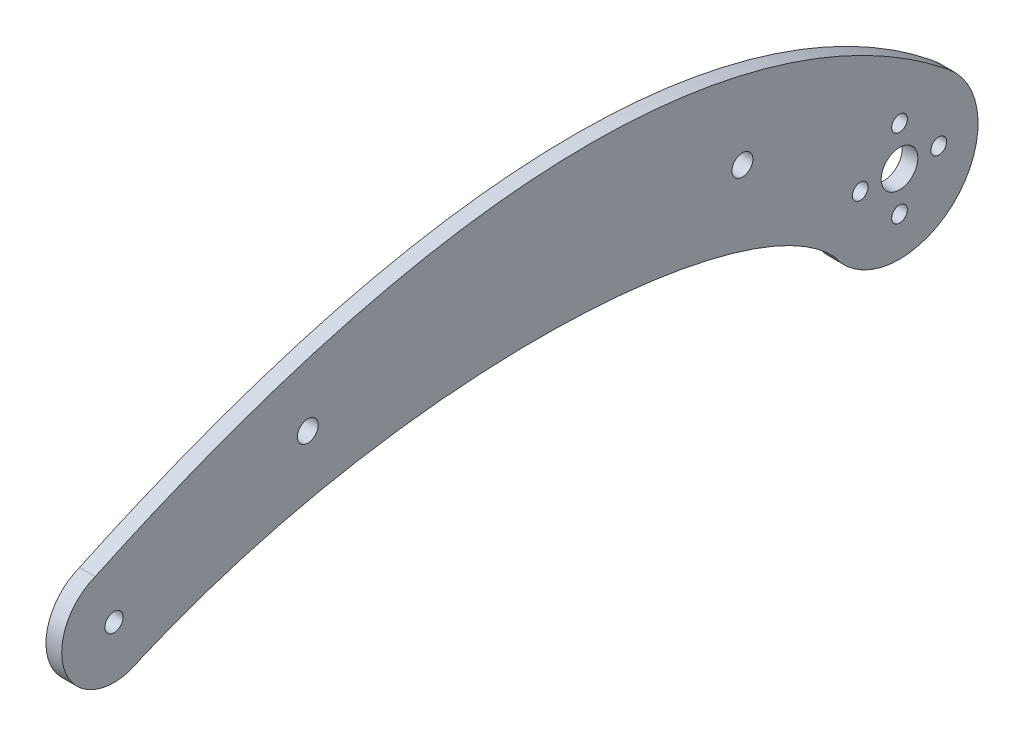
ISO-10303-21;
HEADER;
FILE_DESCRIPTION(('STEP AP214'),'2;1');
FILE_NAME('part.step','',(''),(''),'','','');
FILE_SCHEMA(('AUTOMOTIVE_DESIGN { 1 0 10303 214 1 1 1 1 }'));
ENDSEC;
DATA;
#1=APPLICATION_CONTEXT('core data for automotive mechanical design processes');
#2=APPLICATION_PROTOCOL_DEFINITION('international standard','automotive_design',2000,#1);
#3=PRODUCT_CONTEXT('',#1,'mechanical');
#4=PRODUCT('Part','Part','',(#3));
#5=PRODUCT_RELATED_PRODUCT_CATEGORY('part','',(#4));
#6=PRODUCT_DEFINITION_FORMATION('','',#4);
#7=PRODUCT_DEFINITION_CONTEXT('part definition',#1,'design');
#8=PRODUCT_DEFINITION('design','',#6,#7);
#9=PRODUCT_DEFINITION_SHAPE('','',#8);
#10=(LENGTH_UNIT() NAMED_UNIT(*) SI_UNIT(.MILLI.,.METRE.));
#11=(NAMED_UNIT(*) PLANE_ANGLE_UNIT() SI_UNIT($,.RADIAN.));
#12=(NAMED_UNIT(*) SI_UNIT($,.STERADIAN.) SOLID_ANGLE_UNIT());
#13=UNCERTAINTY_MEASURE_WITH_UNIT(LENGTH_MEASURE(1.E-05),#10,'distance_accuracy_value','');
#14=(GEOMETRIC_REPRESENTATION_CONTEXT(3) GLOBAL_UNCERTAINTY_ASSIGNED_CONTEXT((#13)) GLOBAL_UNIT_ASSIGNED_CONTEXT((#10,
#11,#12)) REPRESENTATION_CONTEXT('',''));
#15=CARTESIAN_POINT('',(0.,0.,0.));
#16=DIRECTION('',(0.,0.,1.));
#17=DIRECTION('',(1.,0.,0.));
#18=AXIS2_PLACEMENT_3D('',#15,#16,#17);
#19=CARTESIAN_POINT('',(3.,6.39651471446297,65.9547983464172));
#20=DIRECTION('',(1.,0.,0.));
#21=DIRECTION('',(0.,0.,-1.));
#22=AXIS2_PLACEMENT_3D('',#19,#20,#21);
#23=PLANE('',#22);
#24=CARTESIAN_POINT('',(3.,7.5,0.));
#25=DIRECTION('',(1.,0.,0.));
#26=DIRECTION('',(0.,0.,-1.));
#27=AXIS2_PLACEMENT_3D('',#24,#25,#26);
#28=CIRCLE('',#27,1.5);
#29=CARTESIAN_POINT('',(3.,7.5,-1.5));
#30=VERTEX_POINT('',#29);
#31=EDGE_CURVE('E168',#30,#30,#28,.T.);
#32=ORIENTED_EDGE('',*,*,#31,.F.);
#33=EDGE_LOOP('',(#32));
#34=FACE_BOUND('',#33,.T.);
#35=CARTESIAN_POINT('',(3.,0.,7.5));
#36=DIRECTION('',(1.,0.,0.));
#37=DIRECTION('',(0.,0.,-1.));
#38=AXIS2_PLACEMENT_3D('',#35,#36,#37);
#39=CIRCLE('',#38,1.5);
#40=CARTESIAN_POINT('',(3.,0.,6.));
#41=VERTEX_POINT('',#40);
#42=EDGE_CURVE('E180',#41,#41,#39,.T.);
#43=ORIENTED_EDGE('',*,*,#42,.F.);
#44=EDGE_LOOP('',(#43));
#45=FACE_BOUND('',#44,.T.);
#46=CARTESIAN_POINT('',(3.,13.1171799999505,113.));
#47=DIRECTION('',(1.,0.,0.));
#48=DIRECTION('',(0.,0.,-1.));
#49=AXIS2_PLACEMENT_3D('',#46,#47,#48);
#50=CIRCLE('',#49,2.);
#51=CARTESIAN_POINT('',(3.,13.1171799999505,111.));
#52=VERTEX_POINT('',#51);
#53=EDGE_CURVE('E192',#52,#52,#50,.T.);
#54=ORIENTED_EDGE('',*,*,#53,.F.);
#55=EDGE_LOOP('',(#54));
#56=FACE_BOUND('',#55,.T.);
#57=CARTESIAN_POINT('',(3.,0.,0.));
#58=DIRECTION('',(1.,0.,0.));
#59=DIRECTION('',(0.,0.,-1.));
#60=AXIS2_PLACEMENT_3D('',#57,#58,#59);
#61=CIRCLE('',#60,3.5);
#62=CARTESIAN_POINT('',(3.,0.,-3.5));
#63=VERTEX_POINT('',#62);
#64=EDGE_CURVE('E204',#63,#63,#61,.T.);
#65=ORIENTED_EDGE('',*,*,#64,.F.);
#66=EDGE_LOOP('',(#65));
#67=FACE_BOUND('',#66,.T.);
#68=CARTESIAN_POINT('',(3.,-8.59851876654942,144.89456416931));
#69=CARTESIAN_POINT('',(3.,13.0893357463916,94.3995636790345));
#70=CARTESIAN_POINT('',(3.,9.60820748675708,29.0217902647538));
#71=CARTESIAN_POINT('',(3.,-8.32199321719293,12.4797607706636));
#72=B_SPLINE_CURVE_WITH_KNOTS('',3,(#68,#69,#70,#71),.UNSPECIFIED.,.F.,.F.,(4,4),(0.,1.),.UNSPECIFIED.);
#73=CARTESIAN_POINT('',(3.,-8.59851876654942,144.89456416931));
#74=VERTEX_POINT('',#73);
#75=CARTESIAN_POINT('',(3.,-8.32199321719289,12.4797607706637));
#76=VERTEX_POINT('',#75);
#77=EDGE_CURVE('E85',#74,#76,#72,.T.);
#78=ORIENTED_EDGE('',*,*,#77,.T.);
#79=CARTESIAN_POINT('',(3.,0.,0.));
#80=DIRECTION('',(1.,0.,0.));
#81=DIRECTION('',(0.,0.,-1.));
#82=AXIS2_PLACEMENT_3D('',#79,#80,#81);
#83=CIRCLE('',#82,15.);
#84=CARTESIAN_POINT('',(3.,11.7832674671061,-9.28195064620789));
#85=VERTEX_POINT('',#84);
#86=EDGE_CURVE('E80',#76,#85,#83,.T.);
#87=ORIENTED_EDGE('',*,*,#86,.T.);
#88=CARTESIAN_POINT('',(3.,11.7832674671061,-9.28195064620791));
#89=CARTESIAN_POINT('',(3.,21.6661173857813,3.02868552316829));
#90=CARTESIAN_POINT('',(3.,57.0174540483026,52.0274645532871));
#91=CARTESIAN_POINT('',(3.,9.33360602277759,153.589400870838));
#92=B_SPLINE_CURVE_WITH_KNOTS('',3,(#88,#89,#90,#91),.UNSPECIFIED.,.F.,.F.,(4,4),(0.,1.),.UNSPECIFIED.);
#93=CARTESIAN_POINT('',(3.,9.33360602277759,153.589400870838));
#94=VERTEX_POINT('',#93);
#95=EDGE_CURVE('E83',#85,#94,#92,.T.);
#96=ORIENTED_EDGE('',*,*,#95,.T.);
#97=CARTESIAN_POINT('',(3.,0.,150.));
#98=DIRECTION('',(1.,0.,0.));
#99=DIRECTION('',(0.,0.,-1.));
#100=AXIS2_PLACEMENT_3D('',#97,#98,#99);
#101=CIRCLE('',#100,10.);
#102=EDGE_CURVE('E50',#94,#74,#101,.T.);
#103=ORIENTED_EDGE('',*,*,#102,.T.);
#104=EDGE_LOOP('',(#78,#87,#96,#103));
#105=FACE_BOUND('',#104,.T.);
#106=CARTESIAN_POINT('',(3.,0.,150.));
#107=DIRECTION('',(1.,0.,0.));
#108=DIRECTION('',(0.,0.,-1.));
#109=AXIS2_PLACEMENT_3D('',#106,#107,#108);
#110=CIRCLE('',#109,1.75000000000001);
#111=CARTESIAN_POINT('',(3.,0.,148.25));
#112=VERTEX_POINT('',#111);
#113=EDGE_CURVE('E198',#112,#112,#110,.T.);
#114=ORIENTED_EDGE('',*,*,#113,.F.);
#115=EDGE_LOOP('',(#114));
#116=FACE_BOUND('',#115,.T.);
#117=CARTESIAN_POINT('',(3.,15.6147810456113,30.));
#118=DIRECTION('',(1.,0.,0.));
#119=DIRECTION('',(0.,0.,-1.));
#120=AXIS2_PLACEMENT_3D('',#117,#118,#119);
#121=CIRCLE('',#120,2.);
#122=CARTESIAN_POINT('',(3.,15.6147810456113,28.));
#123=VERTEX_POINT('',#122);
#124=EDGE_CURVE('E186',#123,#123,#121,.T.);
#125=ORIENTED_EDGE('',*,*,#124,.F.);
#126=EDGE_LOOP('',(#125));
#127=FACE_BOUND('',#126,.T.);
#128=CARTESIAN_POINT('',(3.,-7.5,0.));
#129=DIRECTION('',(1.,0.,0.));
#130=DIRECTION('',(0.,0.,-1.));
#131=AXIS2_PLACEMENT_3D('',#128,#129,#130);
#132=CIRCLE('',#131,1.5);
#133=CARTESIAN_POINT('',(3.,-7.5,-1.5));
#134=VERTEX_POINT('',#133);
#135=EDGE_CURVE('E174',#134,#134,#132,.T.);
#136=ORIENTED_EDGE('',*,*,#135,.F.);
#137=EDGE_LOOP('',(#136));
#138=FACE_BOUND('',#137,.T.);
#139=CARTESIAN_POINT('',(3.,0.,-7.5));
#140=DIRECTION('',(1.,0.,0.));
#141=DIRECTION('',(0.,0.,-1.));
#142=AXIS2_PLACEMENT_3D('',#139,#140,#141);
#143=CIRCLE('',#142,1.5);
#144=CARTESIAN_POINT('',(3.,0.,-9.));
#145=VERTEX_POINT('',#144);
#146=EDGE_CURVE('E159',#145,#145,#143,.T.);
#147=ORIENTED_EDGE('',*,*,#146,.F.);
#148=EDGE_LOOP('',(#147));
#149=FACE_BOUND('',#148,.T.);
#150=ADVANCED_FACE('F32',(#34,#45,#56,#67,#105,#116,#127,#138,#149),#23,.T.);
#151=CARTESIAN_POINT('',(0.,6.39651471446297,65.9547983464172));
#152=DIRECTION('',(1.,0.,0.));
#153=DIRECTION('',(0.,0.,-1.));
#154=AXIS2_PLACEMENT_3D('',#151,#152,#153);
#155=PLANE('',#154);
#156=CARTESIAN_POINT('',(0.,7.5,0.));
#157=DIRECTION('',(1.,0.,0.));
#158=DIRECTION('',(0.,0.,-1.));
#159=AXIS2_PLACEMENT_3D('',#156,#157,#158);
#160=CIRCLE('',#159,1.5);
#161=CARTESIAN_POINT('',(0.,7.5,-1.5));
#162=VERTEX_POINT('',#161);
#163=EDGE_CURVE('E165',#162,#162,#160,.T.);
#164=ORIENTED_EDGE('',*,*,#163,.T.);
#165=EDGE_LOOP('',(#164));
#166=FACE_BOUND('',#165,.T.);
#167=CARTESIAN_POINT('',(0.,0.,7.5));
#168=DIRECTION('',(1.,0.,0.));
#169=DIRECTION('',(0.,0.,-1.));
#170=AXIS2_PLACEMENT_3D('',#167,#168,#169);
#171=CIRCLE('',#170,1.5);
#172=CARTESIAN_POINT('',(0.,0.,6.));
#173=VERTEX_POINT('',#172);
#174=EDGE_CURVE('E177',#173,#173,#171,.T.);
#175=ORIENTED_EDGE('',*,*,#174,.T.);
#176=EDGE_LOOP('',(#175));
#177=FACE_BOUND('',#176,.T.);
#178=CARTESIAN_POINT('',(0.,13.1171799999505,113.));
#179=DIRECTION('',(1.,0.,0.));
#180=DIRECTION('',(0.,0.,-1.));
#181=AXIS2_PLACEMENT_3D('',#178,#179,#180);
#182=CIRCLE('',#181,2.);
#183=CARTESIAN_POINT('',(0.,13.1171799999505,111.));
#184=VERTEX_POINT('',#183);
#185=EDGE_CURVE('E189',#184,#184,#182,.T.);
#186=ORIENTED_EDGE('',*,*,#185,.T.);
#187=EDGE_LOOP('',(#186));
#188=FACE_BOUND('',#187,.T.);
#189=CARTESIAN_POINT('',(0.,0.,0.));
#190=DIRECTION('',(1.,0.,0.));
#191=DIRECTION('',(0.,0.,-1.));
#192=AXIS2_PLACEMENT_3D('',#189,#190,#191);
#193=CIRCLE('',#192,3.5);
#194=CARTESIAN_POINT('',(0.,0.,-3.5));
#195=VERTEX_POINT('',#194);
#196=EDGE_CURVE('E201',#195,#195,#193,.T.);
#197=ORIENTED_EDGE('',*,*,#196,.T.);
#198=EDGE_LOOP('',(#197));
#199=FACE_BOUND('',#198,.T.);
#200=CARTESIAN_POINT('',(0.,-8.59851876654942,144.89456416931));
#201=CARTESIAN_POINT('',(0.,13.0893357463916,94.3995636790345));
#202=CARTESIAN_POINT('',(0.,9.60820748675708,29.0217902647538));
#203=CARTESIAN_POINT('',(0.,-8.32199321719293,12.4797607706636));
#204=B_SPLINE_CURVE_WITH_KNOTS('',3,(#200,#201,#202,#203),.UNSPECIFIED.,.F.,.F.,(4,4),(0.,1.),.UNSPECIFIED.);
#205=CARTESIAN_POINT('',(0.,-8.59851876654942,144.89456416931));
#206=VERTEX_POINT('',#205);
#207=CARTESIAN_POINT('',(0.,-8.32199321719289,12.4797607706637));
#208=VERTEX_POINT('',#207);
#209=EDGE_CURVE('E207',#206,#208,#204,.T.);
#210=ORIENTED_EDGE('',*,*,#209,.F.);
#211=CARTESIAN_POINT('',(0.,0.,150.));
#212=DIRECTION('',(1.,0.,0.));
#213=DIRECTION('',(0.,0.,-1.));
#214=AXIS2_PLACEMENT_3D('',#211,#212,#213);
#215=CIRCLE('',#214,10.);
#216=CARTESIAN_POINT('',(0.,9.33360602277759,153.589400870838));
#217=VERTEX_POINT('',#216);
#218=EDGE_CURVE('E73',#217,#206,#215,.T.);
#219=ORIENTED_EDGE('',*,*,#218,.F.);
#220=CARTESIAN_POINT('',(0.,11.7832674671061,-9.28195064620791));
#221=CARTESIAN_POINT('',(0.,21.6661173857813,3.02868552316829));
#222=CARTESIAN_POINT('',(0.,57.0174540483026,52.0274645532871));
#223=CARTESIAN_POINT('',(0.,9.33360602277759,153.589400870838));
#224=B_SPLINE_CURVE_WITH_KNOTS('',3,(#220,#221,#222,#223),.UNSPECIFIED.,.F.,.F.,(4,4),(0.,1.),.UNSPECIFIED.);
#225=CARTESIAN_POINT('',(0.,11.7832674671061,-9.28195064620789));
#226=VERTEX_POINT('',#225);
#227=EDGE_CURVE('E67',#226,#217,#224,.T.);
#228=ORIENTED_EDGE('',*,*,#227,.F.);
#229=CARTESIAN_POINT('',(0.,0.,0.));
#230=DIRECTION('',(1.,0.,0.));
#231=DIRECTION('',(0.,0.,-1.));
#232=AXIS2_PLACEMENT_3D('',#229,#230,#231);
#233=CIRCLE('',#232,15.);
#234=EDGE_CURVE('E89',#208,#226,#233,.T.);
#235=ORIENTED_EDGE('',*,*,#234,.F.);
#236=EDGE_LOOP('',(#210,#219,#228,#235));
#237=FACE_BOUND('',#236,.T.);
#238=CARTESIAN_POINT('',(0.,0.,150.));
#239=DIRECTION('',(1.,0.,0.));
#240=DIRECTION('',(0.,0.,-1.));
#241=AXIS2_PLACEMENT_3D('',#238,#239,#240);
#242=CIRCLE('',#241,1.75000000000001);
#243=CARTESIAN_POINT('',(0.,0.,148.25));
#244=VERTEX_POINT('',#243);
#245=EDGE_CURVE('E195',#244,#244,#242,.T.);
#246=ORIENTED_EDGE('',*,*,#245,.T.);
#247=EDGE_LOOP('',(#246));
#248=FACE_BOUND('',#247,.T.);
#249=CARTESIAN_POINT('',(0.,15.6147810456113,30.));
#250=DIRECTION('',(1.,0.,0.));
#251=DIRECTION('',(0.,0.,-1.));
#252=AXIS2_PLACEMENT_3D('',#249,#250,#251);
#253=CIRCLE('',#252,2.);
#254=CARTESIAN_POINT('',(0.,15.6147810456113,28.));
#255=VERTEX_POINT('',#254);
#256=EDGE_CURVE('E183',#255,#255,#253,.T.);
#257=ORIENTED_EDGE('',*,*,#256,.T.);
#258=EDGE_LOOP('',(#257));
#259=FACE_BOUND('',#258,.T.);
#260=CARTESIAN_POINT('',(0.,-7.5,0.));
#261=DIRECTION('',(1.,0.,0.));
#262=DIRECTION('',(0.,0.,-1.));
#263=AXIS2_PLACEMENT_3D('',#260,#261,#262);
#264=CIRCLE('',#263,1.5);
#265=CARTESIAN_POINT('',(0.,-7.5,-1.5));
#266=VERTEX_POINT('',#265);
#267=EDGE_CURVE('E171',#266,#266,#264,.T.);
#268=ORIENTED_EDGE('',*,*,#267,.T.);
#269=EDGE_LOOP('',(#268));
#270=FACE_BOUND('',#269,.T.);
#271=CARTESIAN_POINT('',(0.,0.,-7.5));
#272=DIRECTION('',(1.,0.,0.));
#273=DIRECTION('',(0.,0.,-1.));
#274=AXIS2_PLACEMENT_3D('',#271,#272,#273);
#275=CIRCLE('',#274,1.5);
#276=CARTESIAN_POINT('',(0.,0.,-9.));
#277=VERTEX_POINT('',#276);
#278=EDGE_CURVE('E162',#277,#277,#275,.T.);
#279=ORIENTED_EDGE('',*,*,#278,.T.);
#280=EDGE_LOOP('',(#279));
#281=FACE_BOUND('',#280,.T.);
#282=ADVANCED_FACE('F111',(#166,#177,#188,#199,#237,#248,#259,#270,#281),#155,.F.);
#283=DIRECTION('',(-1.,0.,0.));
#284=VECTOR('',#283,1.);
#285=SURFACE_OF_LINEAR_EXTRUSION('',#72,#284);
#286=ORIENTED_EDGE('',*,*,#209,.T.);
#287=DIRECTION('',(-1.,0.,0.));
#288=VECTOR('',#287,1.);
#289=CARTESIAN_POINT('',(3.,-8.32199321719289,12.4797607706637));
#290=LINE('',#289,#288);
#291=EDGE_CURVE('E11',#76,#208,#290,.T.);
#292=ORIENTED_EDGE('',*,*,#291,.F.);
#293=ORIENTED_EDGE('',*,*,#77,.F.);
#294=DIRECTION('',(-1.,0.,0.));
#295=VECTOR('',#294,1.);
#296=CARTESIAN_POINT('',(3.,-8.59851876654942,144.89456416931));
#297=LINE('',#296,#295);
#298=EDGE_CURVE('E93',#74,#206,#297,.T.);
#299=ORIENTED_EDGE('',*,*,#298,.T.);
#300=EDGE_LOOP('',(#286,#292,#293,#299));
#301=FACE_BOUND('',#300,.T.);
#302=ADVANCED_FACE('F34',(#301),#285,.F.);
#303=CARTESIAN_POINT('',(3.,0.,0.));
#304=DIRECTION('',(-1.,0.,0.));
#305=DIRECTION('',(0.,0.,1.));
#306=AXIS2_PLACEMENT_3D('',#303,#304,#305);
#307=CYLINDRICAL_SURFACE('',#306,15.);
#308=ORIENTED_EDGE('',*,*,#234,.T.);
#309=DIRECTION('',(-1.,0.,0.));
#310=VECTOR('',#309,1.);
#311=CARTESIAN_POINT('',(3.,11.7832674671061,-9.28195064620789));
#312=LINE('',#311,#310);
#313=EDGE_CURVE('E42',#85,#226,#312,.T.);
#314=ORIENTED_EDGE('',*,*,#313,.F.);
#315=ORIENTED_EDGE('',*,*,#86,.F.);
#316=ORIENTED_EDGE('',*,*,#291,.T.);
#317=EDGE_LOOP('',(#308,#314,#315,#316));
#318=FACE_BOUND('',#317,.T.);
#319=ADVANCED_FACE('F88',(#318),#307,.T.);
#320=DIRECTION('',(-1.,0.,0.));
#321=VECTOR('',#320,1.);
#322=SURFACE_OF_LINEAR_EXTRUSION('',#92,#321);
#323=ORIENTED_EDGE('',*,*,#227,.T.);
#324=DIRECTION('',(-1.,0.,0.));
#325=VECTOR('',#324,1.);
#326=CARTESIAN_POINT('',(3.,9.33360602277759,153.589400870838));
#327=LINE('',#326,#325);
#328=EDGE_CURVE('E90',#94,#217,#327,.T.);
#329=ORIENTED_EDGE('',*,*,#328,.F.);
#330=ORIENTED_EDGE('',*,*,#95,.F.);
#331=ORIENTED_EDGE('',*,*,#313,.T.);
#332=EDGE_LOOP('',(#323,#329,#330,#331));
#333=FACE_BOUND('',#332,.T.);
#334=ADVANCED_FACE('F91',(#333),#322,.F.);
#335=CARTESIAN_POINT('',(3.,0.,150.));
#336=DIRECTION('',(-1.,0.,0.));
#337=DIRECTION('',(0.,0.,1.));
#338=AXIS2_PLACEMENT_3D('',#335,#336,#337);
#339=CYLINDRICAL_SURFACE('',#338,10.);
#340=ORIENTED_EDGE('',*,*,#218,.T.);
#341=ORIENTED_EDGE('',*,*,#298,.F.);
#342=ORIENTED_EDGE('',*,*,#102,.F.);
#343=ORIENTED_EDGE('',*,*,#328,.T.);
#344=EDGE_LOOP('',(#340,#341,#342,#343));
#345=FACE_BOUND('',#344,.T.);
#346=ADVANCED_FACE('F105',(#345),#339,.T.);
#347=CARTESIAN_POINT('',(3.,0.,0.));
#348=DIRECTION('',(-1.,0.,0.));
#349=DIRECTION('',(0.,0.,1.));
#350=AXIS2_PLACEMENT_3D('',#347,#348,#349);
#351=CYLINDRICAL_SURFACE('',#350,3.5);
#352=ORIENTED_EDGE('',*,*,#64,.T.);
#353=EDGE_LOOP('',(#352));
#354=FACE_BOUND('',#353,.T.);
#355=ORIENTED_EDGE('',*,*,#196,.F.);
#356=EDGE_LOOP('',(#355));
#357=FACE_BOUND('',#356,.T.);
#358=ADVANCED_FACE('F123',(#354,#357),#351,.F.);
#359=CARTESIAN_POINT('',(3.,0.,150.));
#360=DIRECTION('',(-1.,0.,0.));
#361=DIRECTION('',(0.,0.,1.));
#362=AXIS2_PLACEMENT_3D('',#359,#360,#361);
#363=CYLINDRICAL_SURFACE('',#362,1.75000000000001);
#364=ORIENTED_EDGE('',*,*,#113,.T.);
#365=EDGE_LOOP('',(#364));
#366=FACE_BOUND('',#365,.T.);
#367=ORIENTED_EDGE('',*,*,#245,.F.);
#368=EDGE_LOOP('',(#367));
#369=FACE_BOUND('',#368,.T.);
#370=ADVANCED_FACE('F126',(#366,#369),#363,.F.);
#371=CARTESIAN_POINT('',(3.,13.1171799999505,113.));
#372=DIRECTION('',(-1.,0.,0.));
#373=DIRECTION('',(0.,0.,1.));
#374=AXIS2_PLACEMENT_3D('',#371,#372,#373);
#375=CYLINDRICAL_SURFACE('',#374,2.);
#376=ORIENTED_EDGE('',*,*,#53,.T.);
#377=EDGE_LOOP('',(#376));
#378=FACE_BOUND('',#377,.T.);
#379=ORIENTED_EDGE('',*,*,#185,.F.);
#380=EDGE_LOOP('',(#379));
#381=FACE_BOUND('',#380,.T.);
#382=ADVANCED_FACE('F130',(#378,#381),#375,.F.);
#383=CARTESIAN_POINT('',(3.,15.6147810456113,30.));
#384=DIRECTION('',(-1.,0.,0.));
#385=DIRECTION('',(0.,0.,1.));
#386=AXIS2_PLACEMENT_3D('',#383,#384,#385);
#387=CYLINDRICAL_SURFACE('',#386,2.);
#388=ORIENTED_EDGE('',*,*,#124,.T.);
#389=EDGE_LOOP('',(#388));
#390=FACE_BOUND('',#389,.T.);
#391=ORIENTED_EDGE('',*,*,#256,.F.);
#392=EDGE_LOOP('',(#391));
#393=FACE_BOUND('',#392,.T.);
#394=ADVANCED_FACE('F134',(#390,#393),#387,.F.);
#395=CARTESIAN_POINT('',(3.,0.,7.5));
#396=DIRECTION('',(-1.,0.,0.));
#397=DIRECTION('',(0.,0.,1.));
#398=AXIS2_PLACEMENT_3D('',#395,#396,#397);
#399=CYLINDRICAL_SURFACE('',#398,1.5);
#400=ORIENTED_EDGE('',*,*,#42,.T.);
#401=EDGE_LOOP('',(#400));
#402=FACE_BOUND('',#401,.T.);
#403=ORIENTED_EDGE('',*,*,#174,.F.);
#404=EDGE_LOOP('',(#403));
#405=FACE_BOUND('',#404,.T.);
#406=ADVANCED_FACE('F138',(#402,#405),#399,.F.);
#407=CARTESIAN_POINT('',(3.,-7.5,0.));
#408=DIRECTION('',(-1.,0.,0.));
#409=DIRECTION('',(0.,0.,1.));
#410=AXIS2_PLACEMENT_3D('',#407,#408,#409);
#411=CYLINDRICAL_SURFACE('',#410,1.5);
#412=ORIENTED_EDGE('',*,*,#135,.T.);
#413=EDGE_LOOP('',(#412));
#414=FACE_BOUND('',#413,.T.);
#415=ORIENTED_EDGE('',*,*,#267,.F.);
#416=EDGE_LOOP('',(#415));
#417=FACE_BOUND('',#416,.T.);
#418=ADVANCED_FACE('F142',(#414,#417),#411,.F.);
#419=CARTESIAN_POINT('',(3.,7.5,0.));
#420=DIRECTION('',(-1.,0.,0.));
#421=DIRECTION('',(0.,0.,1.));
#422=AXIS2_PLACEMENT_3D('',#419,#420,#421);
#423=CYLINDRICAL_SURFACE('',#422,1.5);
#424=ORIENTED_EDGE('',*,*,#31,.T.);
#425=EDGE_LOOP('',(#424));
#426=FACE_BOUND('',#425,.T.);
#427=ORIENTED_EDGE('',*,*,#163,.F.);
#428=EDGE_LOOP('',(#427));
#429=FACE_BOUND('',#428,.T.);
#430=ADVANCED_FACE('F146',(#426,#429),#423,.F.);
#431=CARTESIAN_POINT('',(3.,0.,-7.5));
#432=DIRECTION('',(-1.,0.,0.));
#433=DIRECTION('',(0.,0.,1.));
#434=AXIS2_PLACEMENT_3D('',#431,#432,#433);
#435=CYLINDRICAL_SURFACE('',#434,1.5);
#436=ORIENTED_EDGE('',*,*,#146,.T.);
#437=EDGE_LOOP('',(#436));
#438=FACE_BOUND('',#437,.T.);
#439=ORIENTED_EDGE('',*,*,#278,.F.);
#440=EDGE_LOOP('',(#439));
#441=FACE_BOUND('',#440,.T.);
#442=ADVANCED_FACE('F150',(#438,#441),#435,.F.);
#443=CLOSED_SHELL('',(#150,#282,#302,#319,#334,#346,#358,#370,#382,#394,#406,#418,#430,#442));
#444=MANIFOLD_SOLID_BREP('B2',#443);
#445=ADVANCED_BREP_SHAPE_REPRESENTATION('',(#18,#444),#14);
#446=SHAPE_DEFINITION_REPRESENTATION(#9,#445);
ENDSEC;
END-ISO-10303-21;
